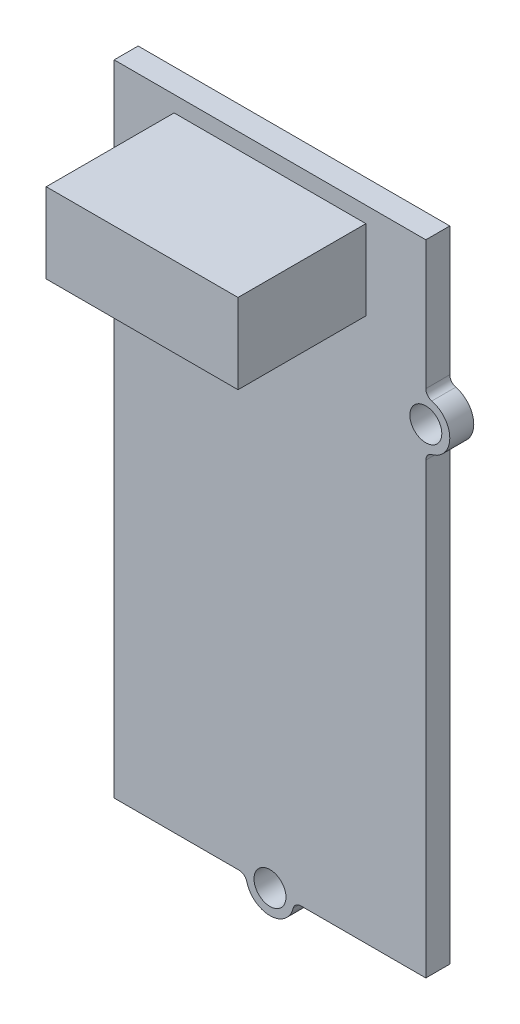
ISO-10303-21;
HEADER;
FILE_DESCRIPTION(('STEP AP214'),'2;1');
FILE_NAME('part.step','',(''),(''),'','','');
FILE_SCHEMA(('AUTOMOTIVE_DESIGN { 1 0 10303 214 1 1 1 1 }'));
ENDSEC;
DATA;
#1=APPLICATION_CONTEXT('core data for automotive mechanical design processes');
#2=APPLICATION_PROTOCOL_DEFINITION('international standard','automotive_design',2000,#1);
#3=PRODUCT_CONTEXT('',#1,'mechanical');
#4=PRODUCT('Part','Part','',(#3));
#5=PRODUCT_RELATED_PRODUCT_CATEGORY('part','',(#4));
#6=PRODUCT_DEFINITION_FORMATION('','',#4);
#7=PRODUCT_DEFINITION_CONTEXT('part definition',#1,'design');
#8=PRODUCT_DEFINITION('design','',#6,#7);
#9=PRODUCT_DEFINITION_SHAPE('','',#8);
#10=(LENGTH_UNIT() NAMED_UNIT(*) SI_UNIT(.MILLI.,.METRE.));
#11=(NAMED_UNIT(*) PLANE_ANGLE_UNIT() SI_UNIT($,.RADIAN.));
#12=(NAMED_UNIT(*) SI_UNIT($,.STERADIAN.) SOLID_ANGLE_UNIT());
#13=UNCERTAINTY_MEASURE_WITH_UNIT(LENGTH_MEASURE(1.E-05),#10,'distance_accuracy_value','');
#14=(GEOMETRIC_REPRESENTATION_CONTEXT(3) GLOBAL_UNCERTAINTY_ASSIGNED_CONTEXT((#13)) GLOBAL_UNIT_ASSIGNED_CONTEXT((#10,
#11,#12)) REPRESENTATION_CONTEXT('',''));
#15=CARTESIAN_POINT('',(0.,0.,0.));
#16=DIRECTION('',(0.,0.,1.));
#17=DIRECTION('',(1.,0.,0.));
#18=AXIS2_PLACEMENT_3D('',#15,#16,#17);
#19=CARTESIAN_POINT('',(0.,0.,1.5));
#20=DIRECTION('',(0.,0.,-1.));
#21=DIRECTION('',(-1.,0.,0.));
#22=AXIS2_PLACEMENT_3D('',#19,#20,#21);
#23=PLANE('',#22);
#24=DIRECTION('',(1.,0.,0.));
#25=VECTOR('',#24,1.);
#26=CARTESIAN_POINT('',(-9.75,-20.,1.5));
#27=LINE('',#26,#25);
#28=CARTESIAN_POINT('',(-9.75,-20.,1.5));
#29=VERTEX_POINT('',#28);
#30=CARTESIAN_POINT('',(-1.93649167310371,-20.,1.5));
#31=VERTEX_POINT('',#30);
#32=EDGE_CURVE('E268',#29,#31,#27,.T.);
#33=ORIENTED_EDGE('',*,*,#32,.T.);
#34=CARTESIAN_POINT('',(-1.93649167310371,-20.5,1.5));
#35=DIRECTION('',(0.,0.,-1.));
#36=DIRECTION('',(-1.,0.,0.));
#37=AXIS2_PLACEMENT_3D('',#34,#35,#36);
#38=CIRCLE('',#37,0.5);
#39=CARTESIAN_POINT('',(-1.45236875482778,-20.375,1.5));
#40=VERTEX_POINT('',#39);
#41=EDGE_CURVE('E347',#31,#40,#38,.T.);
#42=ORIENTED_EDGE('',*,*,#41,.T.);
#43=CARTESIAN_POINT('',(0.,-20.,1.5));
#44=DIRECTION('',(0.,0.,1.));
#45=DIRECTION('',(1.,0.,0.));
#46=AXIS2_PLACEMENT_3D('',#43,#44,#45);
#47=CIRCLE('',#46,1.5);
#48=CARTESIAN_POINT('',(1.45236875482778,-20.375,1.5));
#49=VERTEX_POINT('',#48);
#50=EDGE_CURVE('E226',#40,#49,#47,.T.);
#51=ORIENTED_EDGE('',*,*,#50,.T.);
#52=CARTESIAN_POINT('',(1.93649167310371,-20.5,1.5));
#53=DIRECTION('',(0.,0.,-1.));
#54=DIRECTION('',(-1.,0.,0.));
#55=AXIS2_PLACEMENT_3D('',#52,#53,#54);
#56=CIRCLE('',#55,0.5);
#57=CARTESIAN_POINT('',(1.93649167310371,-20.,1.5));
#58=VERTEX_POINT('',#57);
#59=EDGE_CURVE('E356',#49,#58,#56,.T.);
#60=ORIENTED_EDGE('',*,*,#59,.T.);
#61=CARTESIAN_POINT('',(9.75,-20.,1.5));
#62=VERTEX_POINT('',#61);
#63=EDGE_CURVE('E267',#58,#62,#27,.T.);
#64=ORIENTED_EDGE('',*,*,#63,.T.);
#65=DIRECTION('',(0.,1.,0.));
#66=VECTOR('',#65,1.);
#67=CARTESIAN_POINT('',(9.75,-20.,1.5));
#68=LINE('',#67,#66);
#69=CARTESIAN_POINT('',(9.75,8.06350832689629,1.5));
#70=VERTEX_POINT('',#69);
#71=EDGE_CURVE('E254',#62,#70,#68,.T.);
#72=ORIENTED_EDGE('',*,*,#71,.T.);
#73=CARTESIAN_POINT('',(10.25,8.06350832689629,1.5));
#74=DIRECTION('',(0.,0.,-1.));
#75=DIRECTION('',(-1.,0.,0.));
#76=AXIS2_PLACEMENT_3D('',#73,#74,#75);
#77=CIRCLE('',#76,0.5);
#78=CARTESIAN_POINT('',(10.125,8.54763124517222,1.5));
#79=VERTEX_POINT('',#78);
#80=EDGE_CURVE('E370',#70,#79,#77,.T.);
#81=ORIENTED_EDGE('',*,*,#80,.T.);
#82=CARTESIAN_POINT('',(9.75,10.,1.5));
#83=DIRECTION('',(0.,0.,1.));
#84=DIRECTION('',(1.,0.,0.));
#85=AXIS2_PLACEMENT_3D('',#82,#83,#84);
#86=CIRCLE('',#85,1.5);
#87=CARTESIAN_POINT('',(10.125,11.4523687548278,1.5));
#88=VERTEX_POINT('',#87);
#89=EDGE_CURVE('E242',#79,#88,#86,.T.);
#90=ORIENTED_EDGE('',*,*,#89,.T.);
#91=CARTESIAN_POINT('',(10.25,11.9364916731037,1.5));
#92=DIRECTION('',(0.,0.,-1.));
#93=DIRECTION('',(-1.,0.,0.));
#94=AXIS2_PLACEMENT_3D('',#91,#92,#93);
#95=CIRCLE('',#94,0.5);
#96=CARTESIAN_POINT('',(9.75,11.9364916731037,1.5));
#97=VERTEX_POINT('',#96);
#98=EDGE_CURVE('E11',#88,#97,#95,.T.);
#99=ORIENTED_EDGE('',*,*,#98,.T.);
#100=CARTESIAN_POINT('',(9.75,20.,1.5));
#101=VERTEX_POINT('',#100);
#102=EDGE_CURVE('E259',#97,#101,#68,.T.);
#103=ORIENTED_EDGE('',*,*,#102,.T.);
#104=DIRECTION('',(-1.,0.,0.));
#105=VECTOR('',#104,1.);
#106=CARTESIAN_POINT('',(-9.75,20.,1.5));
#107=LINE('',#106,#105);
#108=CARTESIAN_POINT('',(-9.75,20.,1.5));
#109=VERTEX_POINT('',#108);
#110=EDGE_CURVE('E258',#101,#109,#107,.T.);
#111=ORIENTED_EDGE('',*,*,#110,.T.);
#112=DIRECTION('',(0.,-1.,0.));
#113=VECTOR('',#112,1.);
#114=CARTESIAN_POINT('',(-9.75,-20.,1.5));
#115=LINE('',#114,#113);
#116=CARTESIAN_POINT('',(-9.75,11.9364916731037,1.5));
#117=VERTEX_POINT('',#116);
#118=EDGE_CURVE('E263',#109,#117,#115,.T.);
#119=ORIENTED_EDGE('',*,*,#118,.T.);
#120=CARTESIAN_POINT('',(-10.25,11.9364916731037,1.5));
#121=DIRECTION('',(0.,0.,-1.));
#122=DIRECTION('',(-1.,0.,0.));
#123=AXIS2_PLACEMENT_3D('',#120,#121,#122);
#124=CIRCLE('',#123,0.5);
#125=CARTESIAN_POINT('',(-10.125,11.4523687548278,1.5));
#126=VERTEX_POINT('',#125);
#127=EDGE_CURVE('E365',#117,#126,#124,.T.);
#128=ORIENTED_EDGE('',*,*,#127,.T.);
#129=CARTESIAN_POINT('',(-9.75,10.,1.5));
#130=DIRECTION('',(0.,0.,1.));
#131=DIRECTION('',(1.,0.,0.));
#132=AXIS2_PLACEMENT_3D('',#129,#130,#131);
#133=CIRCLE('',#132,1.5);
#134=CARTESIAN_POINT('',(-10.125,8.54763124517222,1.5));
#135=VERTEX_POINT('',#134);
#136=EDGE_CURVE('E234',#126,#135,#133,.T.);
#137=ORIENTED_EDGE('',*,*,#136,.T.);
#138=CARTESIAN_POINT('',(-10.25,8.0635083268963,1.5));
#139=DIRECTION('',(0.,0.,-1.));
#140=DIRECTION('',(-1.,0.,0.));
#141=AXIS2_PLACEMENT_3D('',#138,#139,#140);
#142=CIRCLE('',#141,0.5);
#143=CARTESIAN_POINT('',(-9.75,8.0635083268963,1.5));
#144=VERTEX_POINT('',#143);
#145=EDGE_CURVE('E362',#135,#144,#142,.T.);
#146=ORIENTED_EDGE('',*,*,#145,.T.);
#147=EDGE_CURVE('E262',#144,#29,#115,.T.);
#148=ORIENTED_EDGE('',*,*,#147,.T.);
#149=EDGE_LOOP('',(#33,#42,#51,#60,#64,#72,#81,#90,#99,#103,#111,#119,#128,#137,#146,#148));
#150=FACE_BOUND('',#149,.T.);
#151=CARTESIAN_POINT('',(-9.75,10.,1.5));
#152=DIRECTION('',(0.,0.,1.));
#153=DIRECTION('',(1.,0.,0.));
#154=AXIS2_PLACEMENT_3D('',#151,#152,#153);
#155=CIRCLE('',#154,1.);
#156=CARTESIAN_POINT('',(-8.75,10.,1.5));
#157=VERTEX_POINT('',#156);
#158=EDGE_CURVE('E214',#157,#157,#155,.T.);
#159=ORIENTED_EDGE('',*,*,#158,.F.);
#160=EDGE_LOOP('',(#159));
#161=FACE_BOUND('',#160,.T.);
#162=CARTESIAN_POINT('',(0.,-20.,1.5));
#163=DIRECTION('',(0.,0.,1.));
#164=DIRECTION('',(1.,0.,0.));
#165=AXIS2_PLACEMENT_3D('',#162,#163,#164);
#166=CIRCLE('',#165,1.);
#167=CARTESIAN_POINT('',(1.,-20.,1.5));
#168=VERTEX_POINT('',#167);
#169=EDGE_CURVE('E197',#168,#168,#166,.T.);
#170=ORIENTED_EDGE('',*,*,#169,.F.);
#171=EDGE_LOOP('',(#170));
#172=FACE_BOUND('',#171,.T.);
#173=CARTESIAN_POINT('',(9.75,10.,1.5));
#174=DIRECTION('',(0.,0.,1.));
#175=DIRECTION('',(1.,0.,0.));
#176=AXIS2_PLACEMENT_3D('',#173,#174,#175);
#177=CIRCLE('',#176,1.);
#178=CARTESIAN_POINT('',(10.75,10.,1.5));
#179=VERTEX_POINT('',#178);
#180=EDGE_CURVE('E215',#179,#179,#177,.T.);
#181=ORIENTED_EDGE('',*,*,#180,.F.);
#182=EDGE_LOOP('',(#181));
#183=FACE_BOUND('',#182,.T.);
#184=DIRECTION('',(0.,-1.,0.));
#185=VECTOR('',#184,1.);
#186=CARTESIAN_POINT('',(-6.,19.,1.5));
#187=LINE('',#186,#185);
#188=CARTESIAN_POINT('',(-6.,19.,1.5));
#189=VERTEX_POINT('',#188);
#190=CARTESIAN_POINT('',(-6.,14.,1.5));
#191=VERTEX_POINT('',#190);
#192=EDGE_CURVE('E195',#189,#191,#187,.T.);
#193=ORIENTED_EDGE('',*,*,#192,.F.);
#194=DIRECTION('',(-1.,0.,0.));
#195=VECTOR('',#194,1.);
#196=CARTESIAN_POINT('',(-6.,19.,1.5));
#197=LINE('',#196,#195);
#198=CARTESIAN_POINT('',(6.,19.,1.5));
#199=VERTEX_POINT('',#198);
#200=EDGE_CURVE('E192',#199,#189,#197,.T.);
#201=ORIENTED_EDGE('',*,*,#200,.F.);
#202=DIRECTION('',(0.,1.,0.));
#203=VECTOR('',#202,1.);
#204=CARTESIAN_POINT('',(6.,19.,1.5));
#205=LINE('',#204,#203);
#206=CARTESIAN_POINT('',(6.,14.,1.5));
#207=VERTEX_POINT('',#206);
#208=EDGE_CURVE('E57',#207,#199,#205,.T.);
#209=ORIENTED_EDGE('',*,*,#208,.F.);
#210=DIRECTION('',(1.,0.,0.));
#211=VECTOR('',#210,1.);
#212=CARTESIAN_POINT('',(-6.,14.,1.5));
#213=LINE('',#212,#211);
#214=EDGE_CURVE('E52',#191,#207,#213,.T.);
#215=ORIENTED_EDGE('',*,*,#214,.F.);
#216=EDGE_LOOP('',(#193,#201,#209,#215));
#217=FACE_BOUND('',#216,.T.);
#218=ADVANCED_FACE('F36',(#150,#161,#172,#183,#217),#23,.F.);
#219=CARTESIAN_POINT('',(-9.75,-20.,1.5));
#220=DIRECTION('',(0.,1.,0.));
#221=DIRECTION('',(0.,0.,1.));
#222=AXIS2_PLACEMENT_3D('',#219,#220,#221);
#223=PLANE('',#222);
#224=DIRECTION('',(1.,0.,0.));
#225=VECTOR('',#224,1.);
#226=CARTESIAN_POINT('',(-9.75,-20.,0.));
#227=LINE('',#226,#225);
#228=CARTESIAN_POINT('',(-9.75,-20.,0.));
#229=VERTEX_POINT('',#228);
#230=CARTESIAN_POINT('',(-1.93649167310371,-20.,0.));
#231=VERTEX_POINT('',#230);
#232=EDGE_CURVE('E286',#229,#231,#227,.T.);
#233=ORIENTED_EDGE('',*,*,#232,.T.);
#234=DIRECTION('',(0.,0.,1.));
#235=VECTOR('',#234,1.);
#236=CARTESIAN_POINT('',(-1.93649167310371,-20.,1.5));
#237=LINE('',#236,#235);
#238=EDGE_CURVE('E305',#231,#31,#237,.T.);
#239=ORIENTED_EDGE('',*,*,#238,.T.);
#240=ORIENTED_EDGE('',*,*,#32,.F.);
#241=DIRECTION('',(0.,0.,-1.));
#242=VECTOR('',#241,1.);
#243=CARTESIAN_POINT('',(-9.75,-20.,1.5));
#244=LINE('',#243,#242);
#245=EDGE_CURVE('E293',#29,#229,#244,.T.);
#246=ORIENTED_EDGE('',*,*,#245,.T.);
#247=EDGE_LOOP('',(#233,#239,#240,#246));
#248=FACE_BOUND('',#247,.T.);
#249=ADVANCED_FACE('F434',(#248),#223,.F.);
#250=CARTESIAN_POINT('',(-9.75,-20.,1.5));
#251=DIRECTION('',(1.,0.,0.));
#252=DIRECTION('',(0.,0.,-1.));
#253=AXIS2_PLACEMENT_3D('',#250,#251,#252);
#254=PLANE('',#253);
#255=DIRECTION('',(0.,-1.,0.));
#256=VECTOR('',#255,1.);
#257=CARTESIAN_POINT('',(-9.75,-20.,0.));
#258=LINE('',#257,#256);
#259=CARTESIAN_POINT('',(-9.75,20.,0.));
#260=VERTEX_POINT('',#259);
#261=CARTESIAN_POINT('',(-9.75,11.9364916731037,0.));
#262=VERTEX_POINT('',#261);
#263=EDGE_CURVE('E281',#260,#262,#258,.T.);
#264=ORIENTED_EDGE('',*,*,#263,.T.);
#265=DIRECTION('',(0.,0.,1.));
#266=VECTOR('',#265,1.);
#267=CARTESIAN_POINT('',(-9.75,11.9364916731037,1.5));
#268=LINE('',#267,#266);
#269=EDGE_CURVE('E329',#262,#117,#268,.T.);
#270=ORIENTED_EDGE('',*,*,#269,.T.);
#271=ORIENTED_EDGE('',*,*,#118,.F.);
#272=DIRECTION('',(0.,0.,-1.));
#273=VECTOR('',#272,1.);
#274=CARTESIAN_POINT('',(-9.75,20.,1.5));
#275=LINE('',#274,#273);
#276=EDGE_CURVE('E297',#109,#260,#275,.T.);
#277=ORIENTED_EDGE('',*,*,#276,.T.);
#278=EDGE_LOOP('',(#264,#270,#271,#277));
#279=FACE_BOUND('',#278,.T.);
#280=ADVANCED_FACE('F439',(#279),#254,.F.);
#281=CARTESIAN_POINT('',(9.75,-20.,1.5));
#282=DIRECTION('',(-1.,0.,0.));
#283=DIRECTION('',(0.,0.,1.));
#284=AXIS2_PLACEMENT_3D('',#281,#282,#283);
#285=PLANE('',#284);
#286=DIRECTION('',(0.,1.,0.));
#287=VECTOR('',#286,1.);
#288=CARTESIAN_POINT('',(9.75,-20.,0.));
#289=LINE('',#288,#287);
#290=CARTESIAN_POINT('',(9.75,-20.,0.));
#291=VERTEX_POINT('',#290);
#292=CARTESIAN_POINT('',(9.75,8.06350832689629,0.));
#293=VERTEX_POINT('',#292);
#294=EDGE_CURVE('E273',#291,#293,#289,.T.);
#295=ORIENTED_EDGE('',*,*,#294,.T.);
#296=DIRECTION('',(0.,0.,1.));
#297=VECTOR('',#296,1.);
#298=CARTESIAN_POINT('',(9.75,8.06350832689629,1.5));
#299=LINE('',#298,#297);
#300=EDGE_CURVE('E333',#293,#70,#299,.T.);
#301=ORIENTED_EDGE('',*,*,#300,.T.);
#302=ORIENTED_EDGE('',*,*,#71,.F.);
#303=DIRECTION('',(0.,0.,-1.));
#304=VECTOR('',#303,1.);
#305=CARTESIAN_POINT('',(9.75,-20.,1.5));
#306=LINE('',#305,#304);
#307=EDGE_CURVE('E272',#62,#291,#306,.T.);
#308=ORIENTED_EDGE('',*,*,#307,.T.);
#309=EDGE_LOOP('',(#295,#301,#302,#308));
#310=FACE_BOUND('',#309,.T.);
#311=ADVANCED_FACE('F461',(#310),#285,.F.);
#312=ORIENTED_EDGE('',*,*,#102,.F.);
#313=DIRECTION('',(0.,0.,1.));
#314=VECTOR('',#313,1.);
#315=CARTESIAN_POINT('',(9.75,11.9364916731037,1.5));
#316=LINE('',#315,#314);
#317=CARTESIAN_POINT('',(9.75,11.9364916731037,0.));
#318=VERTEX_POINT('',#317);
#319=EDGE_CURVE('E343',#97,#318,#316,.F.);
#320=ORIENTED_EDGE('',*,*,#319,.T.);
#321=CARTESIAN_POINT('',(9.75,20.,0.));
#322=VERTEX_POINT('',#321);
#323=EDGE_CURVE('E250',#318,#322,#289,.T.);
#324=ORIENTED_EDGE('',*,*,#323,.T.);
#325=DIRECTION('',(0.,0.,-1.));
#326=VECTOR('',#325,1.);
#327=CARTESIAN_POINT('',(9.75,20.,1.5));
#328=LINE('',#327,#326);
#329=EDGE_CURVE('E301',#101,#322,#328,.T.);
#330=ORIENTED_EDGE('',*,*,#329,.F.);
#331=EDGE_LOOP('',(#312,#320,#324,#330));
#332=FACE_BOUND('',#331,.T.);
#333=ADVANCED_FACE('F397',(#332),#285,.F.);
#334=CARTESIAN_POINT('',(-9.75,20.,1.5));
#335=DIRECTION('',(0.,-1.,0.));
#336=DIRECTION('',(0.,0.,-1.));
#337=AXIS2_PLACEMENT_3D('',#334,#335,#336);
#338=PLANE('',#337);
#339=DIRECTION('',(-1.,0.,0.));
#340=VECTOR('',#339,1.);
#341=CARTESIAN_POINT('',(-9.75,20.,0.));
#342=LINE('',#341,#340);
#343=EDGE_CURVE('E277',#322,#260,#342,.T.);
#344=ORIENTED_EDGE('',*,*,#343,.T.);
#345=ORIENTED_EDGE('',*,*,#276,.F.);
#346=ORIENTED_EDGE('',*,*,#110,.F.);
#347=ORIENTED_EDGE('',*,*,#329,.T.);
#348=EDGE_LOOP('',(#344,#345,#346,#347));
#349=FACE_BOUND('',#348,.T.);
#350=ADVANCED_FACE('F454',(#349),#338,.F.);
#351=ORIENTED_EDGE('',*,*,#147,.F.);
#352=DIRECTION('',(0.,0.,1.));
#353=VECTOR('',#352,1.);
#354=CARTESIAN_POINT('',(-9.75,8.0635083268963,1.5));
#355=LINE('',#354,#353);
#356=CARTESIAN_POINT('',(-9.75,8.0635083268963,0.));
#357=VERTEX_POINT('',#356);
#358=EDGE_CURVE('E319',#144,#357,#355,.F.);
#359=ORIENTED_EDGE('',*,*,#358,.T.);
#360=EDGE_CURVE('E280',#357,#229,#258,.T.);
#361=ORIENTED_EDGE('',*,*,#360,.T.);
#362=ORIENTED_EDGE('',*,*,#245,.F.);
#363=EDGE_LOOP('',(#351,#359,#361,#362));
#364=FACE_BOUND('',#363,.T.);
#365=ADVANCED_FACE('F450',(#364),#254,.F.);
#366=ORIENTED_EDGE('',*,*,#63,.F.);
#367=DIRECTION('',(0.,0.,1.));
#368=VECTOR('',#367,1.);
#369=CARTESIAN_POINT('',(1.93649167310371,-20.,1.5));
#370=LINE('',#369,#368);
#371=CARTESIAN_POINT('',(1.93649167310371,-20.,0.));
#372=VERTEX_POINT('',#371);
#373=EDGE_CURVE('E315',#58,#372,#370,.F.);
#374=ORIENTED_EDGE('',*,*,#373,.T.);
#375=EDGE_CURVE('E285',#372,#291,#227,.T.);
#376=ORIENTED_EDGE('',*,*,#375,.T.);
#377=ORIENTED_EDGE('',*,*,#307,.F.);
#378=EDGE_LOOP('',(#366,#374,#376,#377));
#379=FACE_BOUND('',#378,.T.);
#380=ADVANCED_FACE('F442',(#379),#223,.F.);
#381=CARTESIAN_POINT('',(0.,0.,0.));
#382=DIRECTION('',(0.,0.,-1.));
#383=DIRECTION('',(-1.,0.,0.));
#384=AXIS2_PLACEMENT_3D('',#381,#382,#383);
#385=PLANE('',#384);
#386=CARTESIAN_POINT('',(9.75,10.,0.));
#387=DIRECTION('',(0.,0.,1.));
#388=DIRECTION('',(1.,0.,0.));
#389=AXIS2_PLACEMENT_3D('',#386,#387,#388);
#390=CIRCLE('',#389,1.);
#391=CARTESIAN_POINT('',(10.75,10.,0.));
#392=VERTEX_POINT('',#391);
#393=EDGE_CURVE('E210',#392,#392,#390,.T.);
#394=ORIENTED_EDGE('',*,*,#393,.T.);
#395=EDGE_LOOP('',(#394));
#396=FACE_BOUND('',#395,.T.);
#397=CARTESIAN_POINT('',(0.,-20.,0.));
#398=DIRECTION('',(0.,0.,1.));
#399=DIRECTION('',(1.,0.,0.));
#400=AXIS2_PLACEMENT_3D('',#397,#398,#399);
#401=CIRCLE('',#400,1.);
#402=CARTESIAN_POINT('',(1.,-20.,0.));
#403=VERTEX_POINT('',#402);
#404=EDGE_CURVE('E203',#403,#403,#401,.T.);
#405=ORIENTED_EDGE('',*,*,#404,.T.);
#406=EDGE_LOOP('',(#405));
#407=FACE_BOUND('',#406,.T.);
#408=CARTESIAN_POINT('',(-9.75,10.,0.));
#409=DIRECTION('',(0.,0.,1.));
#410=DIRECTION('',(1.,0.,0.));
#411=AXIS2_PLACEMENT_3D('',#408,#409,#410);
#412=CIRCLE('',#411,1.);
#413=CARTESIAN_POINT('',(-8.75,10.,0.));
#414=VERTEX_POINT('',#413);
#415=EDGE_CURVE('E222',#414,#414,#412,.T.);
#416=ORIENTED_EDGE('',*,*,#415,.T.);
#417=EDGE_LOOP('',(#416));
#418=FACE_BOUND('',#417,.T.);
#419=ORIENTED_EDGE('',*,*,#375,.F.);
#420=CARTESIAN_POINT('',(1.93649167310371,-20.5,0.));
#421=DIRECTION('',(0.,0.,-1.));
#422=DIRECTION('',(-1.,0.,0.));
#423=AXIS2_PLACEMENT_3D('',#420,#421,#422);
#424=CIRCLE('',#423,0.5);
#425=CARTESIAN_POINT('',(1.45236875482778,-20.375,0.));
#426=VERTEX_POINT('',#425);
#427=EDGE_CURVE('E353',#372,#426,#424,.F.);
#428=ORIENTED_EDGE('',*,*,#427,.T.);
#429=CARTESIAN_POINT('',(0.,-20.,0.));
#430=DIRECTION('',(0.,0.,1.));
#431=DIRECTION('',(1.,0.,0.));
#432=AXIS2_PLACEMENT_3D('',#429,#430,#431);
#433=CIRCLE('',#432,1.5);
#434=CARTESIAN_POINT('',(-1.45236875482778,-20.375,0.));
#435=VERTEX_POINT('',#434);
#436=EDGE_CURVE('E230',#435,#426,#433,.T.);
#437=ORIENTED_EDGE('',*,*,#436,.F.);
#438=CARTESIAN_POINT('',(-1.93649167310371,-20.5,0.));
#439=DIRECTION('',(0.,0.,-1.));
#440=DIRECTION('',(-1.,0.,0.));
#441=AXIS2_PLACEMENT_3D('',#438,#439,#440);
#442=CIRCLE('',#441,0.5);
#443=EDGE_CURVE('E350',#435,#231,#442,.F.);
#444=ORIENTED_EDGE('',*,*,#443,.T.);
#445=ORIENTED_EDGE('',*,*,#232,.F.);
#446=ORIENTED_EDGE('',*,*,#360,.F.);
#447=CARTESIAN_POINT('',(-10.25,8.0635083268963,0.));
#448=DIRECTION('',(0.,0.,-1.));
#449=DIRECTION('',(-1.,0.,0.));
#450=AXIS2_PLACEMENT_3D('',#447,#448,#449);
#451=CIRCLE('',#450,0.5);
#452=CARTESIAN_POINT('',(-10.125,8.54763124517222,0.));
#453=VERTEX_POINT('',#452);
#454=EDGE_CURVE('E359',#357,#453,#451,.F.);
#455=ORIENTED_EDGE('',*,*,#454,.T.);
#456=CARTESIAN_POINT('',(-9.75,10.,0.));
#457=DIRECTION('',(0.,0.,1.));
#458=DIRECTION('',(1.,0.,0.));
#459=AXIS2_PLACEMENT_3D('',#456,#457,#458);
#460=CIRCLE('',#459,1.5);
#461=CARTESIAN_POINT('',(-10.125,11.4523687548278,0.));
#462=VERTEX_POINT('',#461);
#463=EDGE_CURVE('E238',#462,#453,#460,.T.);
#464=ORIENTED_EDGE('',*,*,#463,.F.);
#465=CARTESIAN_POINT('',(-10.25,11.9364916731037,0.));
#466=DIRECTION('',(0.,0.,-1.));
#467=DIRECTION('',(-1.,0.,0.));
#468=AXIS2_PLACEMENT_3D('',#465,#466,#467);
#469=CIRCLE('',#468,0.5);
#470=EDGE_CURVE('E367',#462,#262,#469,.F.);
#471=ORIENTED_EDGE('',*,*,#470,.T.);
#472=ORIENTED_EDGE('',*,*,#263,.F.);
#473=ORIENTED_EDGE('',*,*,#343,.F.);
#474=ORIENTED_EDGE('',*,*,#323,.F.);
#475=CARTESIAN_POINT('',(10.25,11.9364916731037,0.));
#476=DIRECTION('',(0.,0.,-1.));
#477=DIRECTION('',(-1.,0.,0.));
#478=AXIS2_PLACEMENT_3D('',#475,#476,#477);
#479=CIRCLE('',#478,0.5);
#480=CARTESIAN_POINT('',(10.125,11.4523687548278,0.));
#481=VERTEX_POINT('',#480);
#482=EDGE_CURVE('E45',#318,#481,#479,.F.);
#483=ORIENTED_EDGE('',*,*,#482,.T.);
#484=CARTESIAN_POINT('',(9.75,10.,0.));
#485=DIRECTION('',(0.,0.,1.));
#486=DIRECTION('',(1.,0.,0.));
#487=AXIS2_PLACEMENT_3D('',#484,#485,#486);
#488=CIRCLE('',#487,1.5);
#489=CARTESIAN_POINT('',(10.125,8.54763124517222,0.));
#490=VERTEX_POINT('',#489);
#491=EDGE_CURVE('E246',#490,#481,#488,.T.);
#492=ORIENTED_EDGE('',*,*,#491,.F.);
#493=CARTESIAN_POINT('',(10.25,8.06350832689629,0.));
#494=DIRECTION('',(0.,0.,-1.));
#495=DIRECTION('',(-1.,0.,0.));
#496=AXIS2_PLACEMENT_3D('',#493,#494,#495);
#497=CIRCLE('',#496,0.5);
#498=EDGE_CURVE('E373',#490,#293,#497,.F.);
#499=ORIENTED_EDGE('',*,*,#498,.T.);
#500=ORIENTED_EDGE('',*,*,#294,.F.);
#501=EDGE_LOOP('',(#419,#428,#437,#444,#445,#446,#455,#464,#471,#472,#473,#474,#483,#492,#499,#500));
#502=FACE_BOUND('',#501,.T.);
#503=ADVANCED_FACE('F380',(#396,#407,#418,#502),#385,.T.);
#504=CARTESIAN_POINT('',(9.75,10.,0.));
#505=DIRECTION('',(0.,0.,1.));
#506=DIRECTION('',(1.,0.,0.));
#507=AXIS2_PLACEMENT_3D('',#504,#505,#506);
#508=CYLINDRICAL_SURFACE('',#507,1.5);
#509=ORIENTED_EDGE('',*,*,#89,.F.);
#510=DIRECTION('',(0.,0.,1.));
#511=VECTOR('',#510,1.);
#512=CARTESIAN_POINT('',(10.125,8.54763124517222,0.));
#513=LINE('',#512,#511);
#514=EDGE_CURVE('E340',#79,#490,#513,.F.);
#515=ORIENTED_EDGE('',*,*,#514,.T.);
#516=ORIENTED_EDGE('',*,*,#491,.T.);
#517=DIRECTION('',(0.,0.,1.));
#518=VECTOR('',#517,1.);
#519=CARTESIAN_POINT('',(10.125,11.4523687548278,0.));
#520=LINE('',#519,#518);
#521=EDGE_CURVE('E337',#481,#88,#520,.T.);
#522=ORIENTED_EDGE('',*,*,#521,.T.);
#523=EDGE_LOOP('',(#509,#515,#516,#522));
#524=FACE_BOUND('',#523,.T.);
#525=ADVANCED_FACE('F388',(#524),#508,.T.);
#526=CARTESIAN_POINT('',(-9.75,10.,0.));
#527=DIRECTION('',(0.,0.,1.));
#528=DIRECTION('',(1.,0.,0.));
#529=AXIS2_PLACEMENT_3D('',#526,#527,#528);
#530=CYLINDRICAL_SURFACE('',#529,1.5);
#531=ORIENTED_EDGE('',*,*,#463,.T.);
#532=DIRECTION('',(0.,0.,1.));
#533=VECTOR('',#532,1.);
#534=CARTESIAN_POINT('',(-10.125,8.54763124517222,0.));
#535=LINE('',#534,#533);
#536=EDGE_CURVE('E326',#453,#135,#535,.T.);
#537=ORIENTED_EDGE('',*,*,#536,.T.);
#538=ORIENTED_EDGE('',*,*,#136,.F.);
#539=DIRECTION('',(0.,0.,1.));
#540=VECTOR('',#539,1.);
#541=CARTESIAN_POINT('',(-10.125,11.4523687548278,0.));
#542=LINE('',#541,#540);
#543=EDGE_CURVE('E323',#126,#462,#542,.F.);
#544=ORIENTED_EDGE('',*,*,#543,.T.);
#545=EDGE_LOOP('',(#531,#537,#538,#544));
#546=FACE_BOUND('',#545,.T.);
#547=ADVANCED_FACE('F511',(#546),#530,.T.);
#548=CARTESIAN_POINT('',(0.,-20.,0.));
#549=DIRECTION('',(0.,0.,1.));
#550=DIRECTION('',(1.,0.,0.));
#551=AXIS2_PLACEMENT_3D('',#548,#549,#550);
#552=CYLINDRICAL_SURFACE('',#551,1.5);
#553=ORIENTED_EDGE('',*,*,#50,.F.);
#554=DIRECTION('',(0.,0.,1.));
#555=VECTOR('',#554,1.);
#556=CARTESIAN_POINT('',(-1.45236875482778,-20.375,0.));
#557=LINE('',#556,#555);
#558=EDGE_CURVE('E312',#40,#435,#557,.F.);
#559=ORIENTED_EDGE('',*,*,#558,.T.);
#560=ORIENTED_EDGE('',*,*,#436,.T.);
#561=DIRECTION('',(0.,0.,1.));
#562=VECTOR('',#561,1.);
#563=CARTESIAN_POINT('',(1.45236875482778,-20.375,0.));
#564=LINE('',#563,#562);
#565=EDGE_CURVE('E309',#426,#49,#564,.T.);
#566=ORIENTED_EDGE('',*,*,#565,.T.);
#567=EDGE_LOOP('',(#553,#559,#560,#566));
#568=FACE_BOUND('',#567,.T.);
#569=ADVANCED_FACE('F498',(#568),#552,.T.);
#570=CARTESIAN_POINT('',(-9.75,10.,0.));
#571=DIRECTION('',(0.,0.,1.));
#572=DIRECTION('',(1.,0.,0.));
#573=AXIS2_PLACEMENT_3D('',#570,#571,#572);
#574=CYLINDRICAL_SURFACE('',#573,1.);
#575=ORIENTED_EDGE('',*,*,#415,.F.);
#576=EDGE_LOOP('',(#575));
#577=FACE_BOUND('',#576,.T.);
#578=ORIENTED_EDGE('',*,*,#158,.T.);
#579=EDGE_LOOP('',(#578));
#580=FACE_BOUND('',#579,.T.);
#581=ADVANCED_FACE('F554',(#577,#580),#574,.F.);
#582=CARTESIAN_POINT('',(0.,-20.,0.));
#583=DIRECTION('',(0.,0.,1.));
#584=DIRECTION('',(1.,0.,0.));
#585=AXIS2_PLACEMENT_3D('',#582,#583,#584);
#586=CYLINDRICAL_SURFACE('',#585,1.);
#587=ORIENTED_EDGE('',*,*,#404,.F.);
#588=EDGE_LOOP('',(#587));
#589=FACE_BOUND('',#588,.T.);
#590=ORIENTED_EDGE('',*,*,#169,.T.);
#591=EDGE_LOOP('',(#590));
#592=FACE_BOUND('',#591,.T.);
#593=ADVANCED_FACE('F560',(#589,#592),#586,.F.);
#594=CARTESIAN_POINT('',(9.75,10.,0.));
#595=DIRECTION('',(0.,0.,1.));
#596=DIRECTION('',(1.,0.,0.));
#597=AXIS2_PLACEMENT_3D('',#594,#595,#596);
#598=CYLINDRICAL_SURFACE('',#597,1.);
#599=ORIENTED_EDGE('',*,*,#393,.F.);
#600=EDGE_LOOP('',(#599));
#601=FACE_BOUND('',#600,.T.);
#602=ORIENTED_EDGE('',*,*,#180,.T.);
#603=EDGE_LOOP('',(#602));
#604=FACE_BOUND('',#603,.T.);
#605=ADVANCED_FACE('F466',(#601,#604),#598,.F.);
#606=CARTESIAN_POINT('',(-1.93649167310371,-20.5,0.));
#607=DIRECTION('',(0.,0.,1.));
#608=DIRECTION('',(1.,0.,0.));
#609=AXIS2_PLACEMENT_3D('',#606,#607,#608);
#610=CYLINDRICAL_SURFACE('',#609,0.5);
#611=ORIENTED_EDGE('',*,*,#443,.F.);
#612=ORIENTED_EDGE('',*,*,#558,.F.);
#613=ORIENTED_EDGE('',*,*,#41,.F.);
#614=ORIENTED_EDGE('',*,*,#238,.F.);
#615=EDGE_LOOP('',(#611,#612,#613,#614));
#616=FACE_BOUND('',#615,.T.);
#617=ADVANCED_FACE('F462',(#616),#610,.F.);
#618=CARTESIAN_POINT('',(1.93649167310371,-20.5,0.));
#619=DIRECTION('',(0.,0.,1.));
#620=DIRECTION('',(1.,0.,0.));
#621=AXIS2_PLACEMENT_3D('',#618,#619,#620);
#622=CYLINDRICAL_SURFACE('',#621,0.5);
#623=ORIENTED_EDGE('',*,*,#59,.F.);
#624=ORIENTED_EDGE('',*,*,#565,.F.);
#625=ORIENTED_EDGE('',*,*,#427,.F.);
#626=ORIENTED_EDGE('',*,*,#373,.F.);
#627=EDGE_LOOP('',(#623,#624,#625,#626));
#628=FACE_BOUND('',#627,.T.);
#629=ADVANCED_FACE('F465',(#628),#622,.F.);
#630=CARTESIAN_POINT('',(-10.25,8.0635083268963,0.));
#631=DIRECTION('',(0.,0.,1.));
#632=DIRECTION('',(1.,0.,0.));
#633=AXIS2_PLACEMENT_3D('',#630,#631,#632);
#634=CYLINDRICAL_SURFACE('',#633,0.5);
#635=ORIENTED_EDGE('',*,*,#145,.F.);
#636=ORIENTED_EDGE('',*,*,#536,.F.);
#637=ORIENTED_EDGE('',*,*,#454,.F.);
#638=ORIENTED_EDGE('',*,*,#358,.F.);
#639=EDGE_LOOP('',(#635,#636,#637,#638));
#640=FACE_BOUND('',#639,.T.);
#641=ADVANCED_FACE('F470',(#640),#634,.F.);
#642=CARTESIAN_POINT('',(-10.25,11.9364916731037,0.));
#643=DIRECTION('',(0.,0.,1.));
#644=DIRECTION('',(1.,0.,0.));
#645=AXIS2_PLACEMENT_3D('',#642,#643,#644);
#646=CYLINDRICAL_SURFACE('',#645,0.5);
#647=ORIENTED_EDGE('',*,*,#470,.F.);
#648=ORIENTED_EDGE('',*,*,#543,.F.);
#649=ORIENTED_EDGE('',*,*,#127,.F.);
#650=ORIENTED_EDGE('',*,*,#269,.F.);
#651=EDGE_LOOP('',(#647,#648,#649,#650));
#652=FACE_BOUND('',#651,.T.);
#653=ADVANCED_FACE('F474',(#652),#646,.F.);
#654=CARTESIAN_POINT('',(10.25,8.06350832689629,0.));
#655=DIRECTION('',(0.,0.,1.));
#656=DIRECTION('',(1.,0.,0.));
#657=AXIS2_PLACEMENT_3D('',#654,#655,#656);
#658=CYLINDRICAL_SURFACE('',#657,0.5);
#659=ORIENTED_EDGE('',*,*,#498,.F.);
#660=ORIENTED_EDGE('',*,*,#514,.F.);
#661=ORIENTED_EDGE('',*,*,#80,.F.);
#662=ORIENTED_EDGE('',*,*,#300,.F.);
#663=EDGE_LOOP('',(#659,#660,#661,#662));
#664=FACE_BOUND('',#663,.T.);
#665=ADVANCED_FACE('F477',(#664),#658,.F.);
#666=CARTESIAN_POINT('',(10.25,11.9364916731037,0.));
#667=DIRECTION('',(0.,0.,1.));
#668=DIRECTION('',(1.,0.,0.));
#669=AXIS2_PLACEMENT_3D('',#666,#667,#668);
#670=CYLINDRICAL_SURFACE('',#669,0.5);
#671=ORIENTED_EDGE('',*,*,#98,.F.);
#672=ORIENTED_EDGE('',*,*,#521,.F.);
#673=ORIENTED_EDGE('',*,*,#482,.F.);
#674=ORIENTED_EDGE('',*,*,#319,.F.);
#675=EDGE_LOOP('',(#671,#672,#673,#674));
#676=FACE_BOUND('',#675,.T.);
#677=ADVANCED_FACE('F38',(#676),#670,.F.);
#678=CARTESIAN_POINT('',(-6.,19.,9.5));
#679=DIRECTION('',(1.,0.,0.));
#680=DIRECTION('',(0.,0.,-1.));
#681=AXIS2_PLACEMENT_3D('',#678,#679,#680);
#682=PLANE('',#681);
#683=ORIENTED_EDGE('',*,*,#192,.T.);
#684=DIRECTION('',(0.,0.,-1.));
#685=VECTOR('',#684,1.);
#686=CARTESIAN_POINT('',(-6.,14.,9.5));
#687=LINE('',#686,#685);
#688=CARTESIAN_POINT('',(-6.,14.,9.5));
#689=VERTEX_POINT('',#688);
#690=EDGE_CURVE('E174',#689,#191,#687,.T.);
#691=ORIENTED_EDGE('',*,*,#690,.F.);
#692=DIRECTION('',(0.,-1.,0.));
#693=VECTOR('',#692,1.);
#694=CARTESIAN_POINT('',(-6.,19.,9.5));
#695=LINE('',#694,#693);
#696=CARTESIAN_POINT('',(-6.,19.,9.5));
#697=VERTEX_POINT('',#696);
#698=EDGE_CURVE('E182',#697,#689,#695,.T.);
#699=ORIENTED_EDGE('',*,*,#698,.F.);
#700=DIRECTION('',(0.,0.,-1.));
#701=VECTOR('',#700,1.);
#702=CARTESIAN_POINT('',(-6.,19.,9.5));
#703=LINE('',#702,#701);
#704=EDGE_CURVE('E402',#697,#189,#703,.T.);
#705=ORIENTED_EDGE('',*,*,#704,.T.);
#706=EDGE_LOOP('',(#683,#691,#699,#705));
#707=FACE_BOUND('',#706,.T.);
#708=ADVANCED_FACE('F194',(#707),#682,.F.);
#709=CARTESIAN_POINT('',(-6.,14.,9.5));
#710=DIRECTION('',(0.,1.,0.));
#711=DIRECTION('',(-1.,0.,0.));
#712=AXIS2_PLACEMENT_3D('',#709,#710,#711);
#713=PLANE('',#712);
#714=ORIENTED_EDGE('',*,*,#214,.T.);
#715=DIRECTION('',(0.,0.,-1.));
#716=VECTOR('',#715,1.);
#717=CARTESIAN_POINT('',(6.,14.,9.5));
#718=LINE('',#717,#716);
#719=CARTESIAN_POINT('',(6.,14.,9.5));
#720=VERTEX_POINT('',#719);
#721=EDGE_CURVE('E177',#720,#207,#718,.T.);
#722=ORIENTED_EDGE('',*,*,#721,.F.);
#723=DIRECTION('',(1.,0.,0.));
#724=VECTOR('',#723,1.);
#725=CARTESIAN_POINT('',(-6.,14.,9.5));
#726=LINE('',#725,#724);
#727=EDGE_CURVE('E170',#689,#720,#726,.T.);
#728=ORIENTED_EDGE('',*,*,#727,.F.);
#729=ORIENTED_EDGE('',*,*,#690,.T.);
#730=EDGE_LOOP('',(#714,#722,#728,#729));
#731=FACE_BOUND('',#730,.T.);
#732=ADVANCED_FACE('F172',(#731),#713,.F.);
#733=CARTESIAN_POINT('',(6.,19.,9.5));
#734=DIRECTION('',(-1.,0.,0.));
#735=DIRECTION('',(0.,-1.,0.));
#736=AXIS2_PLACEMENT_3D('',#733,#734,#735);
#737=PLANE('',#736);
#738=ORIENTED_EDGE('',*,*,#208,.T.);
#739=DIRECTION('',(0.,0.,-1.));
#740=VECTOR('',#739,1.);
#741=CARTESIAN_POINT('',(6.,19.,9.5));
#742=LINE('',#741,#740);
#743=CARTESIAN_POINT('',(6.,19.,9.5));
#744=VERTEX_POINT('',#743);
#745=EDGE_CURVE('E206',#744,#199,#742,.T.);
#746=ORIENTED_EDGE('',*,*,#745,.F.);
#747=DIRECTION('',(0.,1.,0.));
#748=VECTOR('',#747,1.);
#749=CARTESIAN_POINT('',(6.,19.,9.5));
#750=LINE('',#749,#748);
#751=EDGE_CURVE('E181',#720,#744,#750,.T.);
#752=ORIENTED_EDGE('',*,*,#751,.F.);
#753=ORIENTED_EDGE('',*,*,#721,.T.);
#754=EDGE_LOOP('',(#738,#746,#752,#753));
#755=FACE_BOUND('',#754,.T.);
#756=ADVANCED_FACE('F424',(#755),#737,.F.);
#757=CARTESIAN_POINT('',(-6.,19.,9.5));
#758=DIRECTION('',(0.,-1.,0.));
#759=DIRECTION('',(0.,0.,-1.));
#760=AXIS2_PLACEMENT_3D('',#757,#758,#759);
#761=PLANE('',#760);
#762=ORIENTED_EDGE('',*,*,#200,.T.);
#763=ORIENTED_EDGE('',*,*,#704,.F.);
#764=DIRECTION('',(-1.,0.,0.));
#765=VECTOR('',#764,1.);
#766=CARTESIAN_POINT('',(-6.,19.,9.5));
#767=LINE('',#766,#765);
#768=EDGE_CURVE('E187',#744,#697,#767,.T.);
#769=ORIENTED_EDGE('',*,*,#768,.F.);
#770=ORIENTED_EDGE('',*,*,#745,.T.);
#771=EDGE_LOOP('',(#762,#763,#769,#770));
#772=FACE_BOUND('',#771,.T.);
#773=ADVANCED_FACE('F420',(#772),#761,.F.);
#774=CARTESIAN_POINT('',(0.,0.,9.5));
#775=DIRECTION('',(0.,0.,1.));
#776=DIRECTION('',(1.,0.,0.));
#777=AXIS2_PLACEMENT_3D('',#774,#775,#776);
#778=PLANE('',#777);
#779=ORIENTED_EDGE('',*,*,#698,.T.);
#780=ORIENTED_EDGE('',*,*,#727,.T.);
#781=ORIENTED_EDGE('',*,*,#751,.T.);
#782=ORIENTED_EDGE('',*,*,#768,.T.);
#783=EDGE_LOOP('',(#779,#780,#781,#782));
#784=FACE_BOUND('',#783,.T.);
#785=ADVANCED_FACE('F185',(#784),#778,.T.);
#786=CLOSED_SHELL('',(#218,#249,#280,#311,#333,#350,#365,#380,#503,#525,#547,#569,#581,#593,
#605,#617,#629,#641,#653,#665,#677,#708,#732,#756,#773,#785));
#787=MANIFOLD_SOLID_BREP('B2',#786);
#788=ADVANCED_BREP_SHAPE_REPRESENTATION('',(#18,#787),#14);
#789=SHAPE_DEFINITION_REPRESENTATION(#9,#788);
ENDSEC;
END-ISO-10303-21;
